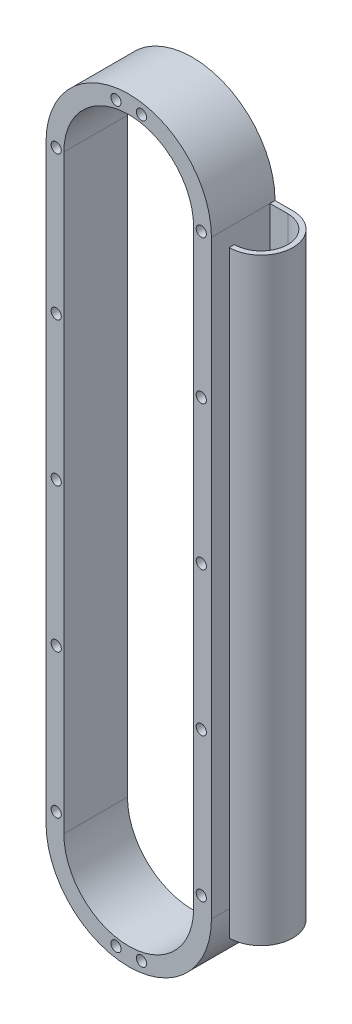
ISO-10303-21;
HEADER;
FILE_DESCRIPTION(('STEP AP214'),'2;1');
FILE_NAME('part.step','',(''),(''),'','','');
FILE_SCHEMA(('AUTOMOTIVE_DESIGN { 1 0 10303 214 1 1 1 1 }'));
ENDSEC;
DATA;
#1=APPLICATION_CONTEXT('core data for automotive mechanical design processes');
#2=APPLICATION_PROTOCOL_DEFINITION('international standard','automotive_design',2000,#1);
#3=PRODUCT_CONTEXT('',#1,'mechanical');
#4=PRODUCT('Part','Part','',(#3));
#5=PRODUCT_RELATED_PRODUCT_CATEGORY('part','',(#4));
#6=PRODUCT_DEFINITION_FORMATION('','',#4);
#7=PRODUCT_DEFINITION_CONTEXT('part definition',#1,'design');
#8=PRODUCT_DEFINITION('design','',#6,#7);
#9=PRODUCT_DEFINITION_SHAPE('','',#8);
#10=(LENGTH_UNIT() NAMED_UNIT(*) SI_UNIT(.MILLI.,.METRE.));
#11=(NAMED_UNIT(*) PLANE_ANGLE_UNIT() SI_UNIT($,.RADIAN.));
#12=(NAMED_UNIT(*) SI_UNIT($,.STERADIAN.) SOLID_ANGLE_UNIT());
#13=UNCERTAINTY_MEASURE_WITH_UNIT(LENGTH_MEASURE(1.E-05),#10,'distance_accuracy_value','');
#14=(GEOMETRIC_REPRESENTATION_CONTEXT(3) GLOBAL_UNCERTAINTY_ASSIGNED_CONTEXT((#13)) GLOBAL_UNIT_ASSIGNED_CONTEXT((#10,
#11,#12)) REPRESENTATION_CONTEXT('',''));
#15=CARTESIAN_POINT('',(0.,0.,0.));
#16=DIRECTION('',(0.,0.,1.));
#17=DIRECTION('',(1.,0.,0.));
#18=AXIS2_PLACEMENT_3D('',#15,#16,#17);
#19=CARTESIAN_POINT('',(28.5,-110.,0.));
#20=DIRECTION('',(0.,0.,1.));
#21=DIRECTION('',(1.,0.,0.));
#22=AXIS2_PLACEMENT_3D('',#19,#20,#21);
#23=CYLINDRICAL_SURFACE('',#22,2.00000000000001);
#24=CARTESIAN_POINT('',(28.5,-110.,0.));
#25=DIRECTION('',(0.,0.,1.));
#26=DIRECTION('',(1.,0.,0.));
#27=AXIS2_PLACEMENT_3D('',#24,#25,#26);
#28=CIRCLE('',#27,2.00000000000001);
#29=CARTESIAN_POINT('',(30.5,-110.,0.));
#30=VERTEX_POINT('',#29);
#31=EDGE_CURVE('E46',#30,#30,#28,.T.);
#32=ORIENTED_EDGE('',*,*,#31,.F.);
#33=EDGE_LOOP('',(#32));
#34=FACE_BOUND('',#33,.T.);
#35=CARTESIAN_POINT('',(28.5,-110.,25.));
#36=DIRECTION('',(0.,0.,1.));
#37=DIRECTION('',(1.,0.,0.));
#38=AXIS2_PLACEMENT_3D('',#35,#36,#37);
#39=CIRCLE('',#38,2.00000000000001);
#40=CARTESIAN_POINT('',(30.5,-110.,25.));
#41=VERTEX_POINT('',#40);
#42=EDGE_CURVE('E11',#41,#41,#39,.T.);
#43=ORIENTED_EDGE('',*,*,#42,.T.);
#44=EDGE_LOOP('',(#43));
#45=FACE_BOUND('',#44,.T.);
#46=ADVANCED_FACE('F39',(#34,#45),#23,.F.);
#47=CARTESIAN_POINT('',(28.5,-53.5,0.));
#48=DIRECTION('',(0.,0.,1.));
#49=DIRECTION('',(1.,0.,0.));
#50=AXIS2_PLACEMENT_3D('',#47,#48,#49);
#51=CYLINDRICAL_SURFACE('',#50,2.00000000000001);
#52=CARTESIAN_POINT('',(28.5,-53.5,0.));
#53=DIRECTION('',(0.,0.,1.));
#54=DIRECTION('',(1.,0.,0.));
#55=AXIS2_PLACEMENT_3D('',#52,#53,#54);
#56=CIRCLE('',#55,2.00000000000001);
#57=CARTESIAN_POINT('',(30.5,-53.5,0.));
#58=VERTEX_POINT('',#57);
#59=EDGE_CURVE('E329',#58,#58,#56,.T.);
#60=ORIENTED_EDGE('',*,*,#59,.F.);
#61=EDGE_LOOP('',(#60));
#62=FACE_BOUND('',#61,.T.);
#63=CARTESIAN_POINT('',(28.5,-53.5,25.));
#64=DIRECTION('',(0.,0.,1.));
#65=DIRECTION('',(1.,0.,0.));
#66=AXIS2_PLACEMENT_3D('',#63,#64,#65);
#67=CIRCLE('',#66,2.00000000000001);
#68=CARTESIAN_POINT('',(30.5,-53.5,25.));
#69=VERTEX_POINT('',#68);
#70=EDGE_CURVE('E332',#69,#69,#67,.T.);
#71=ORIENTED_EDGE('',*,*,#70,.T.);
#72=EDGE_LOOP('',(#71));
#73=FACE_BOUND('',#72,.T.);
#74=ADVANCED_FACE('F341',(#62,#73),#51,.F.);
#75=CARTESIAN_POINT('',(28.5,3.00000000000002,0.));
#76=DIRECTION('',(0.,0.,1.));
#77=DIRECTION('',(1.,0.,0.));
#78=AXIS2_PLACEMENT_3D('',#75,#76,#77);
#79=CYLINDRICAL_SURFACE('',#78,2.00000000000001);
#80=CARTESIAN_POINT('',(28.5,3.00000000000002,0.));
#81=DIRECTION('',(0.,0.,1.));
#82=DIRECTION('',(1.,0.,0.));
#83=AXIS2_PLACEMENT_3D('',#80,#81,#82);
#84=CIRCLE('',#83,2.00000000000001);
#85=CARTESIAN_POINT('',(30.5,3.00000000000002,0.));
#86=VERTEX_POINT('',#85);
#87=EDGE_CURVE('E323',#86,#86,#84,.T.);
#88=ORIENTED_EDGE('',*,*,#87,.F.);
#89=EDGE_LOOP('',(#88));
#90=FACE_BOUND('',#89,.T.);
#91=CARTESIAN_POINT('',(28.5,3.00000000000002,25.));
#92=DIRECTION('',(0.,0.,1.));
#93=DIRECTION('',(1.,0.,0.));
#94=AXIS2_PLACEMENT_3D('',#91,#92,#93);
#95=CIRCLE('',#94,2.00000000000001);
#96=CARTESIAN_POINT('',(30.5,3.00000000000002,25.));
#97=VERTEX_POINT('',#96);
#98=EDGE_CURVE('E326',#97,#97,#95,.T.);
#99=ORIENTED_EDGE('',*,*,#98,.T.);
#100=EDGE_LOOP('',(#99));
#101=FACE_BOUND('',#100,.T.);
#102=ADVANCED_FACE('F346',(#90,#101),#79,.F.);
#103=CARTESIAN_POINT('',(0.,-116.,25.));
#104=DIRECTION('',(0.,0.,1.));
#105=DIRECTION('',(1.,0.,0.));
#106=AXIS2_PLACEMENT_3D('',#103,#104,#105);
#107=PLANE('',#106);
#108=CARTESIAN_POINT('',(-28.5,116.,25.));
#109=DIRECTION('',(0.,0.,-1.));
#110=DIRECTION('',(-1.,0.,0.));
#111=AXIS2_PLACEMENT_3D('',#108,#109,#110);
#112=CIRCLE('',#111,2.00000000000001);
#113=CARTESIAN_POINT('',(-30.5,116.,25.));
#114=VERTEX_POINT('',#113);
#115=EDGE_CURVE('E209',#114,#114,#112,.T.);
#116=ORIENTED_EDGE('',*,*,#115,.T.);
#117=EDGE_LOOP('',(#116));
#118=FACE_BOUND('',#117,.T.);
#119=CARTESIAN_POINT('',(-28.5,59.5,25.));
#120=DIRECTION('',(0.,0.,-1.));
#121=DIRECTION('',(-1.,0.,0.));
#122=AXIS2_PLACEMENT_3D('',#119,#120,#121);
#123=CIRCLE('',#122,2.00000000000001);
#124=CARTESIAN_POINT('',(-30.5,59.5,25.));
#125=VERTEX_POINT('',#124);
#126=EDGE_CURVE('E215',#125,#125,#123,.T.);
#127=ORIENTED_EDGE('',*,*,#126,.T.);
#128=EDGE_LOOP('',(#127));
#129=FACE_BOUND('',#128,.T.);
#130=CARTESIAN_POINT('',(-28.5,3.00000000000002,25.));
#131=DIRECTION('',(0.,0.,-1.));
#132=DIRECTION('',(-1.,0.,0.));
#133=AXIS2_PLACEMENT_3D('',#130,#131,#132);
#134=CIRCLE('',#133,2.00000000000001);
#135=CARTESIAN_POINT('',(-30.5,3.00000000000002,25.));
#136=VERTEX_POINT('',#135);
#137=EDGE_CURVE('E221',#136,#136,#134,.T.);
#138=ORIENTED_EDGE('',*,*,#137,.T.);
#139=EDGE_LOOP('',(#138));
#140=FACE_BOUND('',#139,.T.);
#141=CARTESIAN_POINT('',(-28.5,-53.5,25.));
#142=DIRECTION('',(0.,0.,-1.));
#143=DIRECTION('',(-1.,0.,0.));
#144=AXIS2_PLACEMENT_3D('',#141,#142,#143);
#145=CIRCLE('',#144,2.00000000000001);
#146=CARTESIAN_POINT('',(-30.5,-53.5,25.));
#147=VERTEX_POINT('',#146);
#148=EDGE_CURVE('E227',#147,#147,#145,.T.);
#149=ORIENTED_EDGE('',*,*,#148,.T.);
#150=EDGE_LOOP('',(#149));
#151=FACE_BOUND('',#150,.T.);
#152=CARTESIAN_POINT('',(-28.5,-110.,25.));
#153=DIRECTION('',(0.,0.,-1.));
#154=DIRECTION('',(-1.,0.,0.));
#155=AXIS2_PLACEMENT_3D('',#152,#153,#154);
#156=CIRCLE('',#155,2.00000000000001);
#157=CARTESIAN_POINT('',(-30.5,-110.,25.));
#158=VERTEX_POINT('',#157);
#159=EDGE_CURVE('E204',#158,#158,#156,.T.);
#160=ORIENTED_EDGE('',*,*,#159,.T.);
#161=EDGE_LOOP('',(#160));
#162=FACE_BOUND('',#161,.T.);
#163=CARTESIAN_POINT('',(28.5,59.5,25.));
#164=DIRECTION('',(0.,0.,1.));
#165=DIRECTION('',(1.,0.,0.));
#166=AXIS2_PLACEMENT_3D('',#163,#164,#165);
#167=CIRCLE('',#166,2.00000000000001);
#168=CARTESIAN_POINT('',(30.5,59.5,25.));
#169=VERTEX_POINT('',#168);
#170=EDGE_CURVE('E237',#169,#169,#167,.T.);
#171=ORIENTED_EDGE('',*,*,#170,.F.);
#172=EDGE_LOOP('',(#171));
#173=FACE_BOUND('',#172,.T.);
#174=CARTESIAN_POINT('',(28.5,116.,25.));
#175=DIRECTION('',(0.,0.,1.));
#176=DIRECTION('',(1.,0.,0.));
#177=AXIS2_PLACEMENT_3D('',#174,#175,#176);
#178=CIRCLE('',#177,2.00000000000001);
#179=CARTESIAN_POINT('',(30.5,116.,25.));
#180=VERTEX_POINT('',#179);
#181=EDGE_CURVE('E240',#180,#180,#178,.T.);
#182=ORIENTED_EDGE('',*,*,#181,.F.);
#183=EDGE_LOOP('',(#182));
#184=FACE_BOUND('',#183,.T.);
#185=CARTESIAN_POINT('',(-5.,-144.,25.));
#186=DIRECTION('',(0.,0.,-1.));
#187=DIRECTION('',(1.,0.,0.));
#188=AXIS2_PLACEMENT_3D('',#185,#186,#187);
#189=CIRCLE('',#188,2.);
#190=CARTESIAN_POINT('',(-3.,-144.,25.));
#191=VERTEX_POINT('',#190);
#192=EDGE_CURVE('E251',#191,#191,#189,.T.);
#193=ORIENTED_EDGE('',*,*,#192,.T.);
#194=EDGE_LOOP('',(#193));
#195=FACE_BOUND('',#194,.T.);
#196=CARTESIAN_POINT('',(5.,-144.,25.));
#197=DIRECTION('',(0.,0.,-1.));
#198=DIRECTION('',(1.,0.,0.));
#199=AXIS2_PLACEMENT_3D('',#196,#197,#198);
#200=CIRCLE('',#199,2.);
#201=CARTESIAN_POINT('',(7.,-144.,25.));
#202=VERTEX_POINT('',#201);
#203=EDGE_CURVE('E244',#202,#202,#200,.T.);
#204=ORIENTED_EDGE('',*,*,#203,.T.);
#205=EDGE_LOOP('',(#204));
#206=FACE_BOUND('',#205,.T.);
#207=CARTESIAN_POINT('',(-5.,144.,25.));
#208=DIRECTION('',(0.,0.,1.));
#209=DIRECTION('',(1.,0.,0.));
#210=AXIS2_PLACEMENT_3D('',#207,#208,#209);
#211=CIRCLE('',#210,2.);
#212=CARTESIAN_POINT('',(-3.,144.,25.));
#213=VERTEX_POINT('',#212);
#214=EDGE_CURVE('E262',#213,#213,#211,.T.);
#215=ORIENTED_EDGE('',*,*,#214,.F.);
#216=EDGE_LOOP('',(#215));
#217=FACE_BOUND('',#216,.T.);
#218=CARTESIAN_POINT('',(5.,144.,25.));
#219=DIRECTION('',(0.,0.,1.));
#220=DIRECTION('',(1.,0.,0.));
#221=AXIS2_PLACEMENT_3D('',#218,#219,#220);
#222=CIRCLE('',#221,2.);
#223=CARTESIAN_POINT('',(7.,144.,25.));
#224=VERTEX_POINT('',#223);
#225=EDGE_CURVE('E250',#224,#224,#222,.T.);
#226=ORIENTED_EDGE('',*,*,#225,.F.);
#227=EDGE_LOOP('',(#226));
#228=FACE_BOUND('',#227,.T.);
#229=CARTESIAN_POINT('',(0.,-116.,25.));
#230=DIRECTION('',(0.,0.,1.));
#231=DIRECTION('',(1.,0.,0.));
#232=AXIS2_PLACEMENT_3D('',#229,#230,#231);
#233=CIRCLE('',#232,32.5);
#234=CARTESIAN_POINT('',(-32.5,-116.,25.));
#235=VERTEX_POINT('',#234);
#236=CARTESIAN_POINT('',(32.5,-116.,25.));
#237=VERTEX_POINT('',#236);
#238=EDGE_CURVE('E296',#235,#237,#233,.T.);
#239=ORIENTED_EDGE('',*,*,#238,.T.);
#240=DIRECTION('',(0.,1.,0.));
#241=VECTOR('',#240,1.);
#242=CARTESIAN_POINT('',(32.5,-116.,25.));
#243=LINE('',#242,#241);
#244=CARTESIAN_POINT('',(32.5,116.,25.));
#245=VERTEX_POINT('',#244);
#246=EDGE_CURVE('E299',#237,#245,#243,.T.);
#247=ORIENTED_EDGE('',*,*,#246,.T.);
#248=CARTESIAN_POINT('',(0.,116.,25.));
#249=DIRECTION('',(0.,0.,1.));
#250=DIRECTION('',(1.,0.,0.));
#251=AXIS2_PLACEMENT_3D('',#248,#249,#250);
#252=CIRCLE('',#251,32.5);
#253=CARTESIAN_POINT('',(-32.5,116.,25.));
#254=VERTEX_POINT('',#253);
#255=EDGE_CURVE('E302',#245,#254,#252,.T.);
#256=ORIENTED_EDGE('',*,*,#255,.T.);
#257=DIRECTION('',(0.,-1.,0.));
#258=VECTOR('',#257,1.);
#259=CARTESIAN_POINT('',(-32.5,-116.,25.));
#260=LINE('',#259,#258);
#261=EDGE_CURVE('E304',#254,#235,#260,.T.);
#262=ORIENTED_EDGE('',*,*,#261,.T.);
#263=EDGE_LOOP('',(#239,#247,#256,#262));
#264=FACE_BOUND('',#263,.T.);
#265=DIRECTION('',(0.,1.,0.));
#266=VECTOR('',#265,1.);
#267=CARTESIAN_POINT('',(25.5,-116.,25.));
#268=LINE('',#267,#266);
#269=CARTESIAN_POINT('',(25.5,-116.,25.));
#270=VERTEX_POINT('',#269);
#271=CARTESIAN_POINT('',(25.5,116.,25.));
#272=VERTEX_POINT('',#271);
#273=EDGE_CURVE('E272',#270,#272,#268,.T.);
#274=ORIENTED_EDGE('',*,*,#273,.F.);
#275=CARTESIAN_POINT('',(0.,-116.,25.));
#276=DIRECTION('',(0.,0.,1.));
#277=DIRECTION('',(1.,0.,0.));
#278=AXIS2_PLACEMENT_3D('',#275,#276,#277);
#279=CIRCLE('',#278,25.5);
#280=CARTESIAN_POINT('',(-25.5,-116.,25.));
#281=VERTEX_POINT('',#280);
#282=EDGE_CURVE('E270',#281,#270,#279,.T.);
#283=ORIENTED_EDGE('',*,*,#282,.F.);
#284=DIRECTION('',(0.,-1.,0.));
#285=VECTOR('',#284,1.);
#286=CARTESIAN_POINT('',(-25.5,-116.,25.));
#287=LINE('',#286,#285);
#288=CARTESIAN_POINT('',(-25.5,116.,25.));
#289=VERTEX_POINT('',#288);
#290=EDGE_CURVE('E277',#289,#281,#287,.T.);
#291=ORIENTED_EDGE('',*,*,#290,.F.);
#292=CARTESIAN_POINT('',(0.,116.,25.));
#293=DIRECTION('',(0.,0.,1.));
#294=DIRECTION('',(1.,0.,0.));
#295=AXIS2_PLACEMENT_3D('',#292,#293,#294);
#296=CIRCLE('',#295,25.5);
#297=EDGE_CURVE('E275',#272,#289,#296,.T.);
#298=ORIENTED_EDGE('',*,*,#297,.F.);
#299=EDGE_LOOP('',(#274,#283,#291,#298));
#300=FACE_BOUND('',#299,.T.);
#301=ORIENTED_EDGE('',*,*,#98,.F.);
#302=EDGE_LOOP('',(#301));
#303=FACE_BOUND('',#302,.T.);
#304=ORIENTED_EDGE('',*,*,#70,.F.);
#305=EDGE_LOOP('',(#304));
#306=FACE_BOUND('',#305,.T.);
#307=ORIENTED_EDGE('',*,*,#42,.F.);
#308=EDGE_LOOP('',(#307));
#309=FACE_BOUND('',#308,.T.);
#310=ADVANCED_FACE('F344',(#118,#129,#140,#151,#162,#173,#184,#195,#206,#217,#228,#264,#300,
#303,#306,#309),#107,.T.);
#311=CARTESIAN_POINT('',(0.,-116.,0.));
#312=DIRECTION('',(0.,0.,1.));
#313=DIRECTION('',(1.,0.,0.));
#314=AXIS2_PLACEMENT_3D('',#311,#312,#313);
#315=PLANE('',#314);
#316=CARTESIAN_POINT('',(-28.5,116.,0.));
#317=DIRECTION('',(0.,0.,-1.));
#318=DIRECTION('',(-1.,0.,0.));
#319=AXIS2_PLACEMENT_3D('',#316,#317,#318);
#320=CIRCLE('',#319,2.00000000000001);
#321=CARTESIAN_POINT('',(-30.5,116.,0.));
#322=VERTEX_POINT('',#321);
#323=EDGE_CURVE('E205',#322,#322,#320,.T.);
#324=ORIENTED_EDGE('',*,*,#323,.F.);
#325=EDGE_LOOP('',(#324));
#326=FACE_BOUND('',#325,.T.);
#327=CARTESIAN_POINT('',(-28.5,59.5,0.));
#328=DIRECTION('',(0.,0.,-1.));
#329=DIRECTION('',(-1.,0.,0.));
#330=AXIS2_PLACEMENT_3D('',#327,#328,#329);
#331=CIRCLE('',#330,2.00000000000001);
#332=CARTESIAN_POINT('',(-30.5,59.5,0.));
#333=VERTEX_POINT('',#332);
#334=EDGE_CURVE('E212',#333,#333,#331,.T.);
#335=ORIENTED_EDGE('',*,*,#334,.F.);
#336=EDGE_LOOP('',(#335));
#337=FACE_BOUND('',#336,.T.);
#338=CARTESIAN_POINT('',(-28.5,3.00000000000002,0.));
#339=DIRECTION('',(0.,0.,-1.));
#340=DIRECTION('',(-1.,0.,0.));
#341=AXIS2_PLACEMENT_3D('',#338,#339,#340);
#342=CIRCLE('',#341,2.00000000000001);
#343=CARTESIAN_POINT('',(-30.5,3.00000000000002,0.));
#344=VERTEX_POINT('',#343);
#345=EDGE_CURVE('E218',#344,#344,#342,.T.);
#346=ORIENTED_EDGE('',*,*,#345,.F.);
#347=EDGE_LOOP('',(#346));
#348=FACE_BOUND('',#347,.T.);
#349=CARTESIAN_POINT('',(-28.5,-53.5,0.));
#350=DIRECTION('',(0.,0.,-1.));
#351=DIRECTION('',(-1.,0.,0.));
#352=AXIS2_PLACEMENT_3D('',#349,#350,#351);
#353=CIRCLE('',#352,2.00000000000001);
#354=CARTESIAN_POINT('',(-30.5,-53.5,0.));
#355=VERTEX_POINT('',#354);
#356=EDGE_CURVE('E224',#355,#355,#353,.T.);
#357=ORIENTED_EDGE('',*,*,#356,.F.);
#358=EDGE_LOOP('',(#357));
#359=FACE_BOUND('',#358,.T.);
#360=CARTESIAN_POINT('',(-28.5,-110.,0.));
#361=DIRECTION('',(0.,0.,-1.));
#362=DIRECTION('',(-1.,0.,0.));
#363=AXIS2_PLACEMENT_3D('',#360,#361,#362);
#364=CIRCLE('',#363,2.00000000000001);
#365=CARTESIAN_POINT('',(-30.5,-110.,0.));
#366=VERTEX_POINT('',#365);
#367=EDGE_CURVE('E230',#366,#366,#364,.T.);
#368=ORIENTED_EDGE('',*,*,#367,.F.);
#369=EDGE_LOOP('',(#368));
#370=FACE_BOUND('',#369,.T.);
#371=CARTESIAN_POINT('',(28.5,59.5,0.));
#372=DIRECTION('',(0.,0.,1.));
#373=DIRECTION('',(1.,0.,0.));
#374=AXIS2_PLACEMENT_3D('',#371,#372,#373);
#375=CIRCLE('',#374,2.00000000000001);
#376=CARTESIAN_POINT('',(30.5,59.5,0.));
#377=VERTEX_POINT('',#376);
#378=EDGE_CURVE('E208',#377,#377,#375,.T.);
#379=ORIENTED_EDGE('',*,*,#378,.T.);
#380=EDGE_LOOP('',(#379));
#381=FACE_BOUND('',#380,.T.);
#382=CARTESIAN_POINT('',(28.5,116.,0.));
#383=DIRECTION('',(0.,0.,1.));
#384=DIRECTION('',(1.,0.,0.));
#385=AXIS2_PLACEMENT_3D('',#382,#383,#384);
#386=CIRCLE('',#385,2.00000000000001);
#387=CARTESIAN_POINT('',(30.5,116.,0.));
#388=VERTEX_POINT('',#387);
#389=EDGE_CURVE('E241',#388,#388,#386,.T.);
#390=ORIENTED_EDGE('',*,*,#389,.T.);
#391=EDGE_LOOP('',(#390));
#392=FACE_BOUND('',#391,.T.);
#393=CARTESIAN_POINT('',(-5.,-144.,0.));
#394=DIRECTION('',(0.,0.,-1.));
#395=DIRECTION('',(1.,0.,0.));
#396=AXIS2_PLACEMENT_3D('',#393,#394,#395);
#397=CIRCLE('',#396,2.);
#398=CARTESIAN_POINT('',(-3.,-144.,0.));
#399=VERTEX_POINT('',#398);
#400=EDGE_CURVE('E247',#399,#399,#397,.T.);
#401=ORIENTED_EDGE('',*,*,#400,.F.);
#402=EDGE_LOOP('',(#401));
#403=FACE_BOUND('',#402,.T.);
#404=CARTESIAN_POINT('',(5.,-144.,0.));
#405=DIRECTION('',(0.,0.,-1.));
#406=DIRECTION('',(1.,0.,0.));
#407=AXIS2_PLACEMENT_3D('',#404,#405,#406);
#408=CIRCLE('',#407,2.);
#409=CARTESIAN_POINT('',(7.,-144.,0.));
#410=VERTEX_POINT('',#409);
#411=EDGE_CURVE('E254',#410,#410,#408,.T.);
#412=ORIENTED_EDGE('',*,*,#411,.F.);
#413=EDGE_LOOP('',(#412));
#414=FACE_BOUND('',#413,.T.);
#415=CARTESIAN_POINT('',(-5.,144.,0.));
#416=DIRECTION('',(0.,0.,1.));
#417=DIRECTION('',(1.,0.,0.));
#418=AXIS2_PLACEMENT_3D('',#415,#416,#417);
#419=CIRCLE('',#418,2.);
#420=CARTESIAN_POINT('',(-3.,144.,0.));
#421=VERTEX_POINT('',#420);
#422=EDGE_CURVE('E259',#421,#421,#419,.T.);
#423=ORIENTED_EDGE('',*,*,#422,.T.);
#424=EDGE_LOOP('',(#423));
#425=FACE_BOUND('',#424,.T.);
#426=CARTESIAN_POINT('',(5.,144.,0.));
#427=DIRECTION('',(0.,0.,1.));
#428=DIRECTION('',(1.,0.,0.));
#429=AXIS2_PLACEMENT_3D('',#426,#427,#428);
#430=CIRCLE('',#429,2.);
#431=CARTESIAN_POINT('',(7.,144.,0.));
#432=VERTEX_POINT('',#431);
#433=EDGE_CURVE('E265',#432,#432,#430,.T.);
#434=ORIENTED_EDGE('',*,*,#433,.T.);
#435=EDGE_LOOP('',(#434));
#436=FACE_BOUND('',#435,.T.);
#437=CARTESIAN_POINT('',(0.,-116.,0.));
#438=DIRECTION('',(0.,0.,1.));
#439=DIRECTION('',(1.,0.,0.));
#440=AXIS2_PLACEMENT_3D('',#437,#438,#439);
#441=CIRCLE('',#440,32.5);
#442=CARTESIAN_POINT('',(-32.5,-116.,0.));
#443=VERTEX_POINT('',#442);
#444=CARTESIAN_POINT('',(32.5,-116.,0.));
#445=VERTEX_POINT('',#444);
#446=EDGE_CURVE('E295',#443,#445,#441,.T.);
#447=ORIENTED_EDGE('',*,*,#446,.F.);
#448=DIRECTION('',(0.,-1.,0.));
#449=VECTOR('',#448,1.);
#450=CARTESIAN_POINT('',(-32.5,-116.,0.));
#451=LINE('',#450,#449);
#452=CARTESIAN_POINT('',(-32.5,116.,0.));
#453=VERTEX_POINT('',#452);
#454=EDGE_CURVE('E300',#453,#443,#451,.T.);
#455=ORIENTED_EDGE('',*,*,#454,.F.);
#456=CARTESIAN_POINT('',(0.,116.,0.));
#457=DIRECTION('',(0.,0.,1.));
#458=DIRECTION('',(1.,0.,0.));
#459=AXIS2_PLACEMENT_3D('',#456,#457,#458);
#460=CIRCLE('',#459,32.5);
#461=CARTESIAN_POINT('',(32.5,116.,0.));
#462=VERTEX_POINT('',#461);
#463=EDGE_CURVE('E309',#462,#453,#460,.T.);
#464=ORIENTED_EDGE('',*,*,#463,.F.);
#465=DIRECTION('',(-1.,0.,0.));
#466=VECTOR('',#465,1.);
#467=CARTESIAN_POINT('',(32.5,116.,0.));
#468=LINE('',#467,#466);
#469=CARTESIAN_POINT('',(39.5,116.,0.));
#470=VERTEX_POINT('',#469);
#471=EDGE_CURVE('E166',#470,#462,#468,.T.);
#472=ORIENTED_EDGE('',*,*,#471,.F.);
#473=DIRECTION('',(0.,1.,0.));
#474=VECTOR('',#473,1.);
#475=CARTESIAN_POINT('',(39.5,-119.,0.));
#476=LINE('',#475,#474);
#477=CARTESIAN_POINT('',(39.5,-119.,0.));
#478=VERTEX_POINT('',#477);
#479=EDGE_CURVE('E196',#478,#470,#476,.T.);
#480=ORIENTED_EDGE('',*,*,#479,.F.);
#481=DIRECTION('',(-1.,0.,0.));
#482=VECTOR('',#481,1.);
#483=CARTESIAN_POINT('',(32.5,-119.,0.));
#484=LINE('',#483,#482);
#485=CARTESIAN_POINT('',(32.5,-119.,0.));
#486=VERTEX_POINT('',#485);
#487=EDGE_CURVE('E178',#478,#486,#484,.T.);
#488=ORIENTED_EDGE('',*,*,#487,.T.);
#489=DIRECTION('',(0.,1.,0.));
#490=VECTOR('',#489,1.);
#491=CARTESIAN_POINT('',(32.5,-119.,0.));
#492=LINE('',#491,#490);
#493=EDGE_CURVE('E165',#486,#445,#492,.T.);
#494=ORIENTED_EDGE('',*,*,#493,.T.);
#495=EDGE_LOOP('',(#447,#455,#464,#472,#480,#488,#494));
#496=FACE_BOUND('',#495,.T.);
#497=CARTESIAN_POINT('',(0.,-116.,0.));
#498=DIRECTION('',(0.,0.,1.));
#499=DIRECTION('',(1.,0.,0.));
#500=AXIS2_PLACEMENT_3D('',#497,#498,#499);
#501=CIRCLE('',#500,25.5);
#502=CARTESIAN_POINT('',(-25.5,-116.,0.));
#503=VERTEX_POINT('',#502);
#504=CARTESIAN_POINT('',(25.5,-116.,0.));
#505=VERTEX_POINT('',#504);
#506=EDGE_CURVE('E61',#503,#505,#501,.T.);
#507=ORIENTED_EDGE('',*,*,#506,.T.);
#508=DIRECTION('',(0.,1.,0.));
#509=VECTOR('',#508,1.);
#510=CARTESIAN_POINT('',(25.5,-116.,0.));
#511=LINE('',#510,#509);
#512=CARTESIAN_POINT('',(25.5,116.,0.));
#513=VERTEX_POINT('',#512);
#514=EDGE_CURVE('E281',#505,#513,#511,.T.);
#515=ORIENTED_EDGE('',*,*,#514,.T.);
#516=CARTESIAN_POINT('',(0.,116.,0.));
#517=DIRECTION('',(0.,0.,1.));
#518=DIRECTION('',(1.,0.,0.));
#519=AXIS2_PLACEMENT_3D('',#516,#517,#518);
#520=CIRCLE('',#519,25.5);
#521=CARTESIAN_POINT('',(-25.5,116.,0.));
#522=VERTEX_POINT('',#521);
#523=EDGE_CURVE('E284',#513,#522,#520,.T.);
#524=ORIENTED_EDGE('',*,*,#523,.T.);
#525=DIRECTION('',(0.,-1.,0.));
#526=VECTOR('',#525,1.);
#527=CARTESIAN_POINT('',(-25.5,-116.,0.));
#528=LINE('',#527,#526);
#529=EDGE_CURVE('E273',#522,#503,#528,.T.);
#530=ORIENTED_EDGE('',*,*,#529,.T.);
#531=EDGE_LOOP('',(#507,#515,#524,#530));
#532=FACE_BOUND('',#531,.T.);
#533=ORIENTED_EDGE('',*,*,#87,.T.);
#534=EDGE_LOOP('',(#533));
#535=FACE_BOUND('',#534,.T.);
#536=ORIENTED_EDGE('',*,*,#59,.T.);
#537=EDGE_LOOP('',(#536));
#538=FACE_BOUND('',#537,.T.);
#539=ORIENTED_EDGE('',*,*,#31,.T.);
#540=EDGE_LOOP('',(#539));
#541=FACE_BOUND('',#540,.T.);
#542=ADVANCED_FACE('F337',(#326,#337,#348,#359,#370,#381,#392,#403,#414,#425,#436,#496,#532,
#535,#538,#541),#315,.F.);
#543=CARTESIAN_POINT('',(0.,-116.,25.));
#544=DIRECTION('',(0.,0.,-1.));
#545=DIRECTION('',(-1.,0.,0.));
#546=AXIS2_PLACEMENT_3D('',#543,#544,#545);
#547=CYLINDRICAL_SURFACE('',#546,32.5);
#548=ORIENTED_EDGE('',*,*,#446,.T.);
#549=DIRECTION('',(0.,0.,-1.));
#550=VECTOR('',#549,1.);
#551=CARTESIAN_POINT('',(32.5,-116.,25.));
#552=LINE('',#551,#550);
#553=CARTESIAN_POINT('',(32.5,-116.,2.));
#554=VERTEX_POINT('',#553);
#555=EDGE_CURVE('E195',#554,#445,#552,.T.);
#556=ORIENTED_EDGE('',*,*,#555,.F.);
#557=DIRECTION('',(0.,0.,-1.));
#558=VECTOR('',#557,1.);
#559=CARTESIAN_POINT('',(32.5,-116.,25.));
#560=LINE('',#559,#558);
#561=EDGE_CURVE('E320',#237,#554,#560,.T.);
#562=ORIENTED_EDGE('',*,*,#561,.F.);
#563=ORIENTED_EDGE('',*,*,#238,.F.);
#564=DIRECTION('',(0.,0.,-1.));
#565=VECTOR('',#564,1.);
#566=CARTESIAN_POINT('',(-32.5,-116.,25.));
#567=LINE('',#566,#565);
#568=EDGE_CURVE('E306',#235,#443,#567,.T.);
#569=ORIENTED_EDGE('',*,*,#568,.T.);
#570=EDGE_LOOP('',(#548,#556,#562,#563,#569));
#571=FACE_BOUND('',#570,.T.);
#572=ADVANCED_FACE('F354',(#571),#547,.T.);
#573=CARTESIAN_POINT('',(32.5,-116.,25.));
#574=DIRECTION('',(-1.,0.,0.));
#575=DIRECTION('',(0.,0.,1.));
#576=AXIS2_PLACEMENT_3D('',#573,#574,#575);
#577=PLANE('',#576);
#578=ORIENTED_EDGE('',*,*,#561,.T.);
#579=DIRECTION('',(0.,1.,0.));
#580=VECTOR('',#579,1.);
#581=CARTESIAN_POINT('',(32.5,-119.,2.));
#582=LINE('',#581,#580);
#583=CARTESIAN_POINT('',(32.5,116.,2.));
#584=VERTEX_POINT('',#583);
#585=EDGE_CURVE('E146',#554,#584,#582,.T.);
#586=ORIENTED_EDGE('',*,*,#585,.T.);
#587=DIRECTION('',(0.,0.,-1.));
#588=VECTOR('',#587,1.);
#589=CARTESIAN_POINT('',(32.5,116.,25.));
#590=LINE('',#589,#588);
#591=EDGE_CURVE('E317',#245,#584,#590,.T.);
#592=ORIENTED_EDGE('',*,*,#591,.F.);
#593=ORIENTED_EDGE('',*,*,#246,.F.);
#594=EDGE_LOOP('',(#578,#586,#592,#593));
#595=FACE_BOUND('',#594,.T.);
#596=ADVANCED_FACE('F372',(#595),#577,.F.);
#597=CARTESIAN_POINT('',(0.,116.,25.));
#598=DIRECTION('',(0.,0.,-1.));
#599=DIRECTION('',(-1.,0.,0.));
#600=AXIS2_PLACEMENT_3D('',#597,#598,#599);
#601=CYLINDRICAL_SURFACE('',#600,32.5);
#602=ORIENTED_EDGE('',*,*,#463,.T.);
#603=DIRECTION('',(0.,0.,-1.));
#604=VECTOR('',#603,1.);
#605=CARTESIAN_POINT('',(-32.5,116.,25.));
#606=LINE('',#605,#604);
#607=EDGE_CURVE('E314',#254,#453,#606,.T.);
#608=ORIENTED_EDGE('',*,*,#607,.F.);
#609=ORIENTED_EDGE('',*,*,#255,.F.);
#610=ORIENTED_EDGE('',*,*,#591,.T.);
#611=DIRECTION('',(0.,0.,1.));
#612=VECTOR('',#611,1.);
#613=CARTESIAN_POINT('',(32.5,116.,0.));
#614=LINE('',#613,#612);
#615=EDGE_CURVE('E180',#462,#584,#614,.T.);
#616=ORIENTED_EDGE('',*,*,#615,.F.);
#617=EDGE_LOOP('',(#602,#608,#609,#610,#616));
#618=FACE_BOUND('',#617,.T.);
#619=ADVANCED_FACE('F368',(#618),#601,.T.);
#620=CARTESIAN_POINT('',(-32.5,-116.,25.));
#621=DIRECTION('',(1.,0.,0.));
#622=DIRECTION('',(0.,0.,-1.));
#623=AXIS2_PLACEMENT_3D('',#620,#621,#622);
#624=PLANE('',#623);
#625=ORIENTED_EDGE('',*,*,#454,.T.);
#626=ORIENTED_EDGE('',*,*,#568,.F.);
#627=ORIENTED_EDGE('',*,*,#261,.F.);
#628=ORIENTED_EDGE('',*,*,#607,.T.);
#629=EDGE_LOOP('',(#625,#626,#627,#628));
#630=FACE_BOUND('',#629,.T.);
#631=ADVANCED_FACE('F365',(#630),#624,.F.);
#632=CARTESIAN_POINT('',(0.,-116.,25.));
#633=DIRECTION('',(0.,0.,-1.));
#634=DIRECTION('',(-1.,0.,0.));
#635=AXIS2_PLACEMENT_3D('',#632,#633,#634);
#636=CYLINDRICAL_SURFACE('',#635,25.5);
#637=ORIENTED_EDGE('',*,*,#506,.F.);
#638=DIRECTION('',(0.,0.,-1.));
#639=VECTOR('',#638,1.);
#640=CARTESIAN_POINT('',(-25.5,-116.,25.));
#641=LINE('',#640,#639);
#642=EDGE_CURVE('E279',#281,#503,#641,.T.);
#643=ORIENTED_EDGE('',*,*,#642,.F.);
#644=ORIENTED_EDGE('',*,*,#282,.T.);
#645=DIRECTION('',(0.,0.,-1.));
#646=VECTOR('',#645,1.);
#647=CARTESIAN_POINT('',(25.5,-116.,25.));
#648=LINE('',#647,#646);
#649=EDGE_CURVE('E293',#270,#505,#648,.T.);
#650=ORIENTED_EDGE('',*,*,#649,.T.);
#651=EDGE_LOOP('',(#637,#643,#644,#650));
#652=FACE_BOUND('',#651,.T.);
#653=ADVANCED_FACE('F362',(#652),#636,.F.);
#654=CARTESIAN_POINT('',(25.5,-116.,25.));
#655=DIRECTION('',(-1.,0.,0.));
#656=DIRECTION('',(0.,0.,1.));
#657=AXIS2_PLACEMENT_3D('',#654,#655,#656);
#658=PLANE('',#657);
#659=ORIENTED_EDGE('',*,*,#514,.F.);
#660=ORIENTED_EDGE('',*,*,#649,.F.);
#661=ORIENTED_EDGE('',*,*,#273,.T.);
#662=DIRECTION('',(0.,0.,-1.));
#663=VECTOR('',#662,1.);
#664=CARTESIAN_POINT('',(25.5,116.,25.));
#665=LINE('',#664,#663);
#666=EDGE_CURVE('E291',#272,#513,#665,.T.);
#667=ORIENTED_EDGE('',*,*,#666,.T.);
#668=EDGE_LOOP('',(#659,#660,#661,#667));
#669=FACE_BOUND('',#668,.T.);
#670=ADVANCED_FACE('F557',(#669),#658,.T.);
#671=CARTESIAN_POINT('',(0.,116.,25.));
#672=DIRECTION('',(0.,0.,-1.));
#673=DIRECTION('',(-1.,0.,0.));
#674=AXIS2_PLACEMENT_3D('',#671,#672,#673);
#675=CYLINDRICAL_SURFACE('',#674,25.5);
#676=ORIENTED_EDGE('',*,*,#523,.F.);
#677=ORIENTED_EDGE('',*,*,#666,.F.);
#678=ORIENTED_EDGE('',*,*,#297,.T.);
#679=DIRECTION('',(0.,0.,-1.));
#680=VECTOR('',#679,1.);
#681=CARTESIAN_POINT('',(-25.5,116.,25.));
#682=LINE('',#681,#680);
#683=EDGE_CURVE('E53',#289,#522,#682,.T.);
#684=ORIENTED_EDGE('',*,*,#683,.T.);
#685=EDGE_LOOP('',(#676,#677,#678,#684));
#686=FACE_BOUND('',#685,.T.);
#687=ADVANCED_FACE('F555',(#686),#675,.F.);
#688=CARTESIAN_POINT('',(-25.5,-116.,25.));
#689=DIRECTION('',(1.,0.,0.));
#690=DIRECTION('',(0.,0.,-1.));
#691=AXIS2_PLACEMENT_3D('',#688,#689,#690);
#692=PLANE('',#691);
#693=ORIENTED_EDGE('',*,*,#529,.F.);
#694=ORIENTED_EDGE('',*,*,#683,.F.);
#695=ORIENTED_EDGE('',*,*,#290,.T.);
#696=ORIENTED_EDGE('',*,*,#642,.T.);
#697=EDGE_LOOP('',(#693,#694,#695,#696));
#698=FACE_BOUND('',#697,.T.);
#699=ADVANCED_FACE('F551',(#698),#692,.T.);
#700=CARTESIAN_POINT('',(5.,144.,0.));
#701=DIRECTION('',(0.,0.,1.));
#702=DIRECTION('',(1.,0.,0.));
#703=AXIS2_PLACEMENT_3D('',#700,#701,#702);
#704=CYLINDRICAL_SURFACE('',#703,2.);
#705=ORIENTED_EDGE('',*,*,#433,.F.);
#706=EDGE_LOOP('',(#705));
#707=FACE_BOUND('',#706,.T.);
#708=ORIENTED_EDGE('',*,*,#225,.T.);
#709=EDGE_LOOP('',(#708));
#710=FACE_BOUND('',#709,.T.);
#711=ADVANCED_FACE('F547',(#707,#710),#704,.F.);
#712=CARTESIAN_POINT('',(-5.,144.,0.));
#713=DIRECTION('',(0.,0.,1.));
#714=DIRECTION('',(1.,0.,0.));
#715=AXIS2_PLACEMENT_3D('',#712,#713,#714);
#716=CYLINDRICAL_SURFACE('',#715,2.);
#717=ORIENTED_EDGE('',*,*,#422,.F.);
#718=EDGE_LOOP('',(#717));
#719=FACE_BOUND('',#718,.T.);
#720=ORIENTED_EDGE('',*,*,#214,.T.);
#721=EDGE_LOOP('',(#720));
#722=FACE_BOUND('',#721,.T.);
#723=ADVANCED_FACE('F543',(#719,#722),#716,.F.);
#724=CARTESIAN_POINT('',(5.,-144.,0.));
#725=DIRECTION('',(0.,0.,1.));
#726=DIRECTION('',(1.,0.,0.));
#727=AXIS2_PLACEMENT_3D('',#724,#725,#726);
#728=CYLINDRICAL_SURFACE('',#727,2.);
#729=ORIENTED_EDGE('',*,*,#411,.T.);
#730=EDGE_LOOP('',(#729));
#731=FACE_BOUND('',#730,.T.);
#732=ORIENTED_EDGE('',*,*,#203,.F.);
#733=EDGE_LOOP('',(#732));
#734=FACE_BOUND('',#733,.T.);
#735=ADVANCED_FACE('F539',(#731,#734),#728,.F.);
#736=CARTESIAN_POINT('',(-5.,-144.,0.));
#737=DIRECTION('',(0.,0.,1.));
#738=DIRECTION('',(1.,0.,0.));
#739=AXIS2_PLACEMENT_3D('',#736,#737,#738);
#740=CYLINDRICAL_SURFACE('',#739,2.);
#741=ORIENTED_EDGE('',*,*,#400,.T.);
#742=EDGE_LOOP('',(#741));
#743=FACE_BOUND('',#742,.T.);
#744=ORIENTED_EDGE('',*,*,#192,.F.);
#745=EDGE_LOOP('',(#744));
#746=FACE_BOUND('',#745,.T.);
#747=ADVANCED_FACE('F535',(#743,#746),#740,.F.);
#748=CARTESIAN_POINT('',(28.5,116.,0.));
#749=DIRECTION('',(0.,0.,1.));
#750=DIRECTION('',(1.,0.,0.));
#751=AXIS2_PLACEMENT_3D('',#748,#749,#750);
#752=CYLINDRICAL_SURFACE('',#751,2.00000000000001);
#753=ORIENTED_EDGE('',*,*,#389,.F.);
#754=EDGE_LOOP('',(#753));
#755=FACE_BOUND('',#754,.T.);
#756=ORIENTED_EDGE('',*,*,#181,.T.);
#757=EDGE_LOOP('',(#756));
#758=FACE_BOUND('',#757,.T.);
#759=ADVANCED_FACE('F403',(#755,#758),#752,.F.);
#760=CARTESIAN_POINT('',(28.5,59.5,0.));
#761=DIRECTION('',(0.,0.,1.));
#762=DIRECTION('',(1.,0.,0.));
#763=AXIS2_PLACEMENT_3D('',#760,#761,#762);
#764=CYLINDRICAL_SURFACE('',#763,2.00000000000001);
#765=ORIENTED_EDGE('',*,*,#378,.F.);
#766=EDGE_LOOP('',(#765));
#767=FACE_BOUND('',#766,.T.);
#768=ORIENTED_EDGE('',*,*,#170,.T.);
#769=EDGE_LOOP('',(#768));
#770=FACE_BOUND('',#769,.T.);
#771=ADVANCED_FACE('F400',(#767,#770),#764,.F.);
#772=CARTESIAN_POINT('',(-28.5,-110.,0.));
#773=DIRECTION('',(0.,0.,1.));
#774=DIRECTION('',(1.,0.,0.));
#775=AXIS2_PLACEMENT_3D('',#772,#773,#774);
#776=CYLINDRICAL_SURFACE('',#775,2.00000000000001);
#777=ORIENTED_EDGE('',*,*,#367,.T.);
#778=EDGE_LOOP('',(#777));
#779=FACE_BOUND('',#778,.T.);
#780=ORIENTED_EDGE('',*,*,#159,.F.);
#781=EDGE_LOOP('',(#780));
#782=FACE_BOUND('',#781,.T.);
#783=ADVANCED_FACE('F402',(#779,#782),#776,.F.);
#784=CARTESIAN_POINT('',(-28.5,-53.5,0.));
#785=DIRECTION('',(0.,0.,1.));
#786=DIRECTION('',(1.,0.,0.));
#787=AXIS2_PLACEMENT_3D('',#784,#785,#786);
#788=CYLINDRICAL_SURFACE('',#787,2.00000000000001);
#789=ORIENTED_EDGE('',*,*,#356,.T.);
#790=EDGE_LOOP('',(#789));
#791=FACE_BOUND('',#790,.T.);
#792=ORIENTED_EDGE('',*,*,#148,.F.);
#793=EDGE_LOOP('',(#792));
#794=FACE_BOUND('',#793,.T.);
#795=ADVANCED_FACE('F416',(#791,#794),#788,.F.);
#796=CARTESIAN_POINT('',(-28.5,3.00000000000002,0.));
#797=DIRECTION('',(0.,0.,1.));
#798=DIRECTION('',(1.,0.,0.));
#799=AXIS2_PLACEMENT_3D('',#796,#797,#798);
#800=CYLINDRICAL_SURFACE('',#799,2.00000000000001);
#801=ORIENTED_EDGE('',*,*,#345,.T.);
#802=EDGE_LOOP('',(#801));
#803=FACE_BOUND('',#802,.T.);
#804=ORIENTED_EDGE('',*,*,#137,.F.);
#805=EDGE_LOOP('',(#804));
#806=FACE_BOUND('',#805,.T.);
#807=ADVANCED_FACE('F427',(#803,#806),#800,.F.);
#808=CARTESIAN_POINT('',(-28.5,59.5,0.));
#809=DIRECTION('',(0.,0.,1.));
#810=DIRECTION('',(1.,0.,0.));
#811=AXIS2_PLACEMENT_3D('',#808,#809,#810);
#812=CYLINDRICAL_SURFACE('',#811,2.00000000000001);
#813=ORIENTED_EDGE('',*,*,#334,.T.);
#814=EDGE_LOOP('',(#813));
#815=FACE_BOUND('',#814,.T.);
#816=ORIENTED_EDGE('',*,*,#126,.F.);
#817=EDGE_LOOP('',(#816));
#818=FACE_BOUND('',#817,.T.);
#819=ADVANCED_FACE('F437',(#815,#818),#812,.F.);
#820=CARTESIAN_POINT('',(-28.5,116.,0.));
#821=DIRECTION('',(0.,0.,1.));
#822=DIRECTION('',(1.,0.,0.));
#823=AXIS2_PLACEMENT_3D('',#820,#821,#822);
#824=CYLINDRICAL_SURFACE('',#823,2.00000000000001);
#825=ORIENTED_EDGE('',*,*,#323,.T.);
#826=EDGE_LOOP('',(#825));
#827=FACE_BOUND('',#826,.T.);
#828=ORIENTED_EDGE('',*,*,#115,.F.);
#829=EDGE_LOOP('',(#828));
#830=FACE_BOUND('',#829,.T.);
#831=ADVANCED_FACE('F447',(#827,#830),#824,.F.);
#832=CARTESIAN_POINT('',(32.5,-119.,0.));
#833=DIRECTION('',(-1.,0.,0.));
#834=DIRECTION('',(0.,0.,1.));
#835=AXIS2_PLACEMENT_3D('',#832,#833,#834);
#836=PLANE('',#835);
#837=CARTESIAN_POINT('',(32.5,-119.,2.));
#838=VERTEX_POINT('',#837);
#839=EDGE_CURVE('E141',#838,#554,#582,.T.);
#840=ORIENTED_EDGE('',*,*,#839,.T.);
#841=ORIENTED_EDGE('',*,*,#555,.T.);
#842=ORIENTED_EDGE('',*,*,#493,.F.);
#843=DIRECTION('',(0.,0.,1.));
#844=VECTOR('',#843,1.);
#845=CARTESIAN_POINT('',(32.5,-119.,0.));
#846=LINE('',#845,#844);
#847=EDGE_CURVE('E157',#486,#838,#846,.T.);
#848=ORIENTED_EDGE('',*,*,#847,.T.);
#849=EDGE_LOOP('',(#840,#841,#842,#848));
#850=FACE_BOUND('',#849,.T.);
#851=ADVANCED_FACE('F163',(#850),#836,.T.);
#852=CARTESIAN_POINT('',(39.5,-119.,12.5));
#853=DIRECTION('',(0.,1.,0.));
#854=DIRECTION('',(0.,0.,1.));
#855=AXIS2_PLACEMENT_3D('',#852,#853,#854);
#856=CYLINDRICAL_SURFACE('',#855,12.5);
#857=CARTESIAN_POINT('',(39.5,116.,12.5));
#858=DIRECTION('',(0.,1.,0.));
#859=DIRECTION('',(0.,0.,-1.));
#860=AXIS2_PLACEMENT_3D('',#857,#858,#859);
#861=CIRCLE('',#860,12.5);
#862=CARTESIAN_POINT('',(39.5,116.,25.));
#863=VERTEX_POINT('',#862);
#864=EDGE_CURVE('E168',#863,#470,#861,.T.);
#865=ORIENTED_EDGE('',*,*,#864,.F.);
#866=DIRECTION('',(0.,1.,0.));
#867=VECTOR('',#866,1.);
#868=CARTESIAN_POINT('',(39.5,-119.,25.));
#869=LINE('',#868,#867);
#870=CARTESIAN_POINT('',(39.5,-119.,25.));
#871=VERTEX_POINT('',#870);
#872=EDGE_CURVE('E198',#871,#863,#869,.T.);
#873=ORIENTED_EDGE('',*,*,#872,.F.);
#874=CARTESIAN_POINT('',(39.5,-119.,12.5));
#875=DIRECTION('',(0.,1.,0.));
#876=DIRECTION('',(0.,0.,-1.));
#877=AXIS2_PLACEMENT_3D('',#874,#875,#876);
#878=CIRCLE('',#877,12.5);
#879=EDGE_CURVE('E175',#871,#478,#878,.T.);
#880=ORIENTED_EDGE('',*,*,#879,.T.);
#881=ORIENTED_EDGE('',*,*,#479,.T.);
#882=EDGE_LOOP('',(#865,#873,#880,#881));
#883=FACE_BOUND('',#882,.T.);
#884=ADVANCED_FACE('F475',(#883),#856,.T.);
#885=CARTESIAN_POINT('',(39.5,-119.,25.));
#886=DIRECTION('',(-1.,0.,0.));
#887=DIRECTION('',(0.,0.,1.));
#888=AXIS2_PLACEMENT_3D('',#885,#886,#887);
#889=PLANE('',#888);
#890=DIRECTION('',(0.,0.,1.));
#891=VECTOR('',#890,1.);
#892=CARTESIAN_POINT('',(39.5,116.,25.));
#893=LINE('',#892,#891);
#894=CARTESIAN_POINT('',(39.5,116.,23.));
#895=VERTEX_POINT('',#894);
#896=EDGE_CURVE('E189',#895,#863,#893,.T.);
#897=ORIENTED_EDGE('',*,*,#896,.F.);
#898=DIRECTION('',(0.,1.,0.));
#899=VECTOR('',#898,1.);
#900=CARTESIAN_POINT('',(39.5,-119.,23.));
#901=LINE('',#900,#899);
#902=CARTESIAN_POINT('',(39.5,-119.,23.));
#903=VERTEX_POINT('',#902);
#904=EDGE_CURVE('E200',#903,#895,#901,.T.);
#905=ORIENTED_EDGE('',*,*,#904,.F.);
#906=DIRECTION('',(0.,0.,1.));
#907=VECTOR('',#906,1.);
#908=CARTESIAN_POINT('',(39.5,-119.,25.));
#909=LINE('',#908,#907);
#910=EDGE_CURVE('E172',#903,#871,#909,.T.);
#911=ORIENTED_EDGE('',*,*,#910,.T.);
#912=ORIENTED_EDGE('',*,*,#872,.T.);
#913=EDGE_LOOP('',(#897,#905,#911,#912));
#914=FACE_BOUND('',#913,.T.);
#915=ADVANCED_FACE('F484',(#914),#889,.T.);
#916=CARTESIAN_POINT('',(39.5,-119.,12.5));
#917=DIRECTION('',(0.,1.,0.));
#918=DIRECTION('',(0.,0.,1.));
#919=AXIS2_PLACEMENT_3D('',#916,#917,#918);
#920=CYLINDRICAL_SURFACE('',#919,10.5);
#921=CARTESIAN_POINT('',(39.5,116.,12.5));
#922=DIRECTION('',(0.,-1.,0.));
#923=DIRECTION('',(0.,0.,-1.));
#924=AXIS2_PLACEMENT_3D('',#921,#922,#923);
#925=CIRCLE('',#924,10.5);
#926=CARTESIAN_POINT('',(39.5,116.,2.));
#927=VERTEX_POINT('',#926);
#928=EDGE_CURVE('E186',#927,#895,#925,.T.);
#929=ORIENTED_EDGE('',*,*,#928,.F.);
#930=DIRECTION('',(0.,1.,0.));
#931=VECTOR('',#930,1.);
#932=CARTESIAN_POINT('',(39.5,-119.,2.));
#933=LINE('',#932,#931);
#934=CARTESIAN_POINT('',(39.5,-119.,2.));
#935=VERTEX_POINT('',#934);
#936=EDGE_CURVE('E150',#935,#927,#933,.T.);
#937=ORIENTED_EDGE('',*,*,#936,.F.);
#938=CARTESIAN_POINT('',(39.5,-119.,12.5));
#939=DIRECTION('',(0.,-1.,0.));
#940=DIRECTION('',(0.,0.,-1.));
#941=AXIS2_PLACEMENT_3D('',#938,#939,#940);
#942=CIRCLE('',#941,10.5);
#943=EDGE_CURVE('E161',#935,#903,#942,.T.);
#944=ORIENTED_EDGE('',*,*,#943,.T.);
#945=ORIENTED_EDGE('',*,*,#904,.T.);
#946=EDGE_LOOP('',(#929,#937,#944,#945));
#947=FACE_BOUND('',#946,.T.);
#948=ADVANCED_FACE('F494',(#947),#920,.F.);
#949=CARTESIAN_POINT('',(32.5,-119.,2.));
#950=DIRECTION('',(0.,0.,1.));
#951=DIRECTION('',(1.,0.,0.));
#952=AXIS2_PLACEMENT_3D('',#949,#950,#951);
#953=PLANE('',#952);
#954=DIRECTION('',(1.,0.,0.));
#955=VECTOR('',#954,1.);
#956=CARTESIAN_POINT('',(32.5,116.,2.));
#957=LINE('',#956,#955);
#958=EDGE_CURVE('E183',#584,#927,#957,.T.);
#959=ORIENTED_EDGE('',*,*,#958,.F.);
#960=ORIENTED_EDGE('',*,*,#585,.F.);
#961=ORIENTED_EDGE('',*,*,#839,.F.);
#962=DIRECTION('',(1.,0.,0.));
#963=VECTOR('',#962,1.);
#964=CARTESIAN_POINT('',(32.5,-119.,2.));
#965=LINE('',#964,#963);
#966=EDGE_CURVE('E144',#838,#935,#965,.T.);
#967=ORIENTED_EDGE('',*,*,#966,.T.);
#968=ORIENTED_EDGE('',*,*,#936,.T.);
#969=EDGE_LOOP('',(#959,#960,#961,#967,#968));
#970=FACE_BOUND('',#969,.T.);
#971=ADVANCED_FACE('F143',(#970),#953,.T.);
#972=CARTESIAN_POINT('',(39.5,-119.,12.5));
#973=DIRECTION('',(0.,-1.,0.));
#974=DIRECTION('',(0.,0.,-1.));
#975=AXIS2_PLACEMENT_3D('',#972,#973,#974);
#976=PLANE('',#975);
#977=ORIENTED_EDGE('',*,*,#847,.F.);
#978=ORIENTED_EDGE('',*,*,#487,.F.);
#979=ORIENTED_EDGE('',*,*,#879,.F.);
#980=ORIENTED_EDGE('',*,*,#910,.F.);
#981=ORIENTED_EDGE('',*,*,#943,.F.);
#982=ORIENTED_EDGE('',*,*,#966,.F.);
#983=EDGE_LOOP('',(#977,#978,#979,#980,#981,#982));
#984=FACE_BOUND('',#983,.T.);
#985=ADVANCED_FACE('F155',(#984),#976,.T.);
#986=CARTESIAN_POINT('',(39.5,116.,12.5));
#987=DIRECTION('',(0.,-1.,0.));
#988=DIRECTION('',(0.,0.,-1.));
#989=AXIS2_PLACEMENT_3D('',#986,#987,#988);
#990=PLANE('',#989);
#991=ORIENTED_EDGE('',*,*,#615,.T.);
#992=ORIENTED_EDGE('',*,*,#958,.T.);
#993=ORIENTED_EDGE('',*,*,#928,.T.);
#994=ORIENTED_EDGE('',*,*,#896,.T.);
#995=ORIENTED_EDGE('',*,*,#864,.T.);
#996=ORIENTED_EDGE('',*,*,#471,.T.);
#997=EDGE_LOOP('',(#991,#992,#993,#994,#995,#996));
#998=FACE_BOUND('',#997,.T.);
#999=ADVANCED_FACE('F521',(#998),#990,.F.);
#1000=CLOSED_SHELL('',(#46,#74,#102,#310,#542,#572,#596,#619,#631,#653,#670,#687,#699,#711,#723,
#735,#747,#759,#771,#783,#795,#807,#819,#831,#851,#884,#915,#948,#971,#985,#999));
#1001=MANIFOLD_SOLID_BREP('B2',#1000);
#1002=ADVANCED_BREP_SHAPE_REPRESENTATION('',(#18,#1001),#14);
#1003=SHAPE_DEFINITION_REPRESENTATION(#9,#1002);
ENDSEC;
END-ISO-10303-21;
